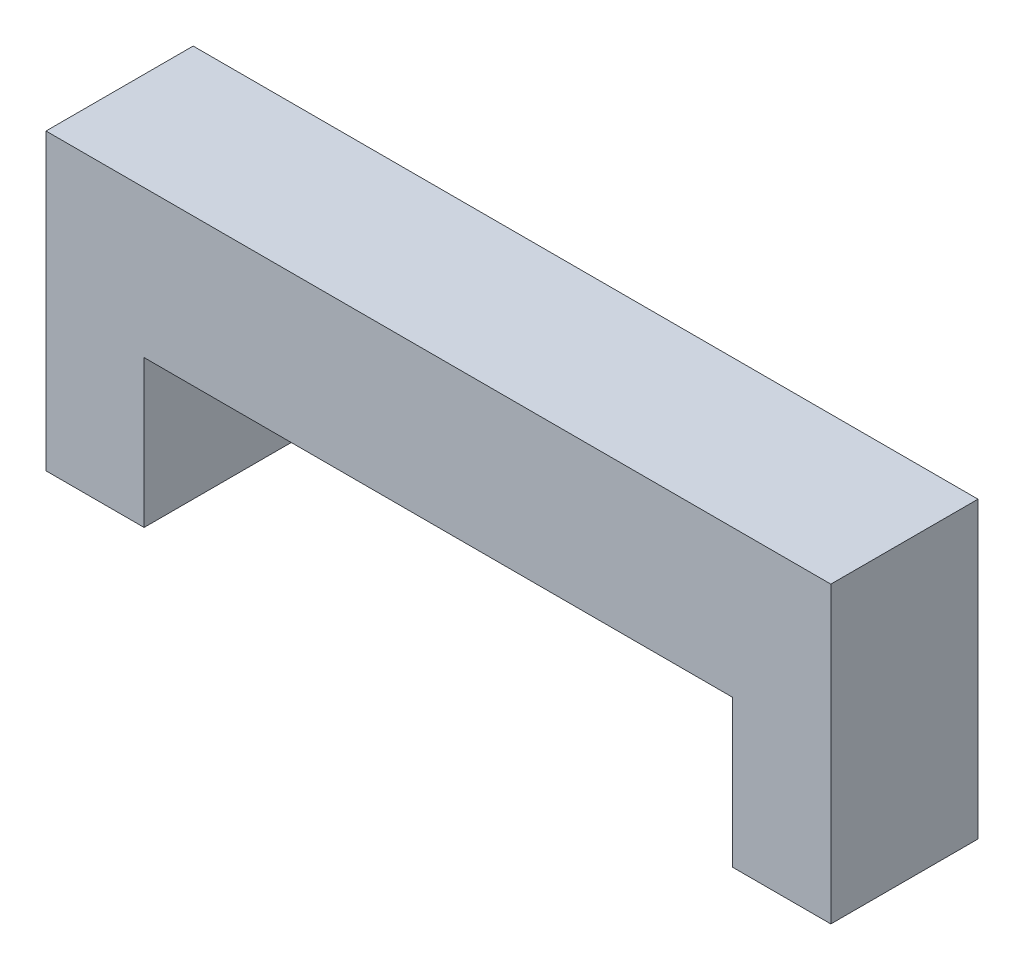
ISO-10303-21;
HEADER;
FILE_DESCRIPTION(('STEP AP214'),'2;1');
FILE_NAME('part.step','',(''),(''),'','','');
FILE_SCHEMA(('AUTOMOTIVE_DESIGN { 1 0 10303 214 1 1 1 1 }'));
ENDSEC;
DATA;
#1=APPLICATION_CONTEXT('core data for automotive mechanical design processes');
#2=APPLICATION_PROTOCOL_DEFINITION('international standard','automotive_design',2000,#1);
#3=PRODUCT_CONTEXT('',#1,'mechanical');
#4=PRODUCT('Part','Part','',(#3));
#5=PRODUCT_RELATED_PRODUCT_CATEGORY('part','',(#4));
#6=PRODUCT_DEFINITION_FORMATION('','',#4);
#7=PRODUCT_DEFINITION_CONTEXT('part definition',#1,'design');
#8=PRODUCT_DEFINITION('design','',#6,#7);
#9=PRODUCT_DEFINITION_SHAPE('','',#8);
#10=(LENGTH_UNIT() NAMED_UNIT(*) SI_UNIT(.MILLI.,.METRE.));
#11=(NAMED_UNIT(*) PLANE_ANGLE_UNIT() SI_UNIT($,.RADIAN.));
#12=(NAMED_UNIT(*) SI_UNIT($,.STERADIAN.) SOLID_ANGLE_UNIT());
#13=UNCERTAINTY_MEASURE_WITH_UNIT(LENGTH_MEASURE(1.E-05),#10,'distance_accuracy_value','');
#14=(GEOMETRIC_REPRESENTATION_CONTEXT(3) GLOBAL_UNCERTAINTY_ASSIGNED_CONTEXT((#13)) GLOBAL_UNIT_ASSIGNED_CONTEXT((#10,
#11,#12)) REPRESENTATION_CONTEXT('',''));
#15=CARTESIAN_POINT('',(0.,0.,0.));
#16=DIRECTION('',(0.,0.,1.));
#17=DIRECTION('',(1.,0.,0.));
#18=AXIS2_PLACEMENT_3D('',#15,#16,#17);
#19=CARTESIAN_POINT('',(-22.688524590164,9.08196721311476,3.));
#20=DIRECTION('',(1.,0.,0.));
#21=DIRECTION('',(0.,0.,-1.));
#22=AXIS2_PLACEMENT_3D('',#19,#20,#21);
#23=PLANE('',#22);
#24=DIRECTION('',(0.,-1.,0.));
#25=VECTOR('',#24,1.);
#26=CARTESIAN_POINT('',(-22.688524590164,9.08196721311476,0.));
#27=LINE('',#26,#25);
#28=CARTESIAN_POINT('',(-22.688524590164,9.08196721311476,0.));
#29=VERTEX_POINT('',#28);
#30=CARTESIAN_POINT('',(-22.688524590164,3.08196721311476,0.));
#31=VERTEX_POINT('',#30);
#32=EDGE_CURVE('E129',#29,#31,#27,.T.);
#33=ORIENTED_EDGE('',*,*,#32,.T.);
#34=DIRECTION('',(0.,0.,-1.));
#35=VECTOR('',#34,1.);
#36=CARTESIAN_POINT('',(-22.688524590164,3.08196721311476,3.));
#37=LINE('',#36,#35);
#38=CARTESIAN_POINT('',(-22.688524590164,3.08196721311476,3.));
#39=VERTEX_POINT('',#38);
#40=EDGE_CURVE('E11',#39,#31,#37,.T.);
#41=ORIENTED_EDGE('',*,*,#40,.F.);
#42=DIRECTION('',(0.,-1.,0.));
#43=VECTOR('',#42,1.);
#44=CARTESIAN_POINT('',(-22.688524590164,9.08196721311476,3.));
#45=LINE('',#44,#43);
#46=CARTESIAN_POINT('',(-22.688524590164,9.08196721311476,3.));
#47=VERTEX_POINT('',#46);
#48=EDGE_CURVE('E143',#47,#39,#45,.T.);
#49=ORIENTED_EDGE('',*,*,#48,.F.);
#50=DIRECTION('',(0.,0.,-1.));
#51=VECTOR('',#50,1.);
#52=CARTESIAN_POINT('',(-22.688524590164,9.08196721311476,3.));
#53=LINE('',#52,#51);
#54=EDGE_CURVE('E125',#47,#29,#53,.T.);
#55=ORIENTED_EDGE('',*,*,#54,.T.);
#56=EDGE_LOOP('',(#33,#41,#49,#55));
#57=FACE_BOUND('',#56,.T.);
#58=ADVANCED_FACE('F33',(#57),#23,.F.);
#59=CARTESIAN_POINT('',(-22.688524590164,3.08196721311476,3.));
#60=DIRECTION('',(0.,1.,0.));
#61=DIRECTION('',(0.,0.,1.));
#62=AXIS2_PLACEMENT_3D('',#59,#60,#61);
#63=PLANE('',#62);
#64=DIRECTION('',(1.,0.,0.));
#65=VECTOR('',#64,1.);
#66=CARTESIAN_POINT('',(-22.688524590164,3.08196721311476,0.));
#67=LINE('',#66,#65);
#68=CARTESIAN_POINT('',(-20.688524590164,3.08196721311476,0.));
#69=VERTEX_POINT('',#68);
#70=EDGE_CURVE('E132',#31,#69,#67,.T.);
#71=ORIENTED_EDGE('',*,*,#70,.T.);
#72=DIRECTION('',(0.,0.,-1.));
#73=VECTOR('',#72,1.);
#74=CARTESIAN_POINT('',(-20.688524590164,3.08196721311476,3.));
#75=LINE('',#74,#73);
#76=CARTESIAN_POINT('',(-20.688524590164,3.08196721311476,3.));
#77=VERTEX_POINT('',#76);
#78=EDGE_CURVE('E41',#77,#69,#75,.T.);
#79=ORIENTED_EDGE('',*,*,#78,.F.);
#80=DIRECTION('',(1.,0.,0.));
#81=VECTOR('',#80,1.);
#82=CARTESIAN_POINT('',(-22.688524590164,3.08196721311476,3.));
#83=LINE('',#82,#81);
#84=EDGE_CURVE('E92',#39,#77,#83,.T.);
#85=ORIENTED_EDGE('',*,*,#84,.F.);
#86=ORIENTED_EDGE('',*,*,#40,.T.);
#87=EDGE_LOOP('',(#71,#79,#85,#86));
#88=FACE_BOUND('',#87,.T.);
#89=ADVANCED_FACE('F178',(#88),#63,.F.);
#90=CARTESIAN_POINT('',(-20.688524590164,3.08196721311476,3.));
#91=DIRECTION('',(-1.,0.,0.));
#92=DIRECTION('',(0.,0.,1.));
#93=AXIS2_PLACEMENT_3D('',#90,#91,#92);
#94=PLANE('',#93);
#95=DIRECTION('',(0.,1.,0.));
#96=VECTOR('',#95,1.);
#97=CARTESIAN_POINT('',(-20.688524590164,3.08196721311476,0.));
#98=LINE('',#97,#96);
#99=CARTESIAN_POINT('',(-20.688524590164,6.08196721311476,0.));
#100=VERTEX_POINT('',#99);
#101=EDGE_CURVE('E134',#69,#100,#98,.T.);
#102=ORIENTED_EDGE('',*,*,#101,.T.);
#103=DIRECTION('',(0.,0.,-1.));
#104=VECTOR('',#103,1.);
#105=CARTESIAN_POINT('',(-20.688524590164,6.08196721311476,3.));
#106=LINE('',#105,#104);
#107=CARTESIAN_POINT('',(-20.688524590164,6.08196721311476,3.));
#108=VERTEX_POINT('',#107);
#109=EDGE_CURVE('E150',#108,#100,#106,.T.);
#110=ORIENTED_EDGE('',*,*,#109,.F.);
#111=DIRECTION('',(0.,1.,0.));
#112=VECTOR('',#111,1.);
#113=CARTESIAN_POINT('',(-20.688524590164,3.08196721311476,3.));
#114=LINE('',#113,#112);
#115=EDGE_CURVE('E158',#77,#108,#114,.T.);
#116=ORIENTED_EDGE('',*,*,#115,.F.);
#117=ORIENTED_EDGE('',*,*,#78,.T.);
#118=EDGE_LOOP('',(#102,#110,#116,#117));
#119=FACE_BOUND('',#118,.T.);
#120=ADVANCED_FACE('F156',(#119),#94,.F.);
#121=CARTESIAN_POINT('',(-20.688524590164,6.08196721311476,3.));
#122=DIRECTION('',(0.,1.,0.));
#123=DIRECTION('',(-1.,0.,0.));
#124=AXIS2_PLACEMENT_3D('',#121,#122,#123);
#125=PLANE('',#124);
#126=DIRECTION('',(1.,0.,0.));
#127=VECTOR('',#126,1.);
#128=CARTESIAN_POINT('',(-20.688524590164,6.08196721311476,0.));
#129=LINE('',#128,#127);
#130=CARTESIAN_POINT('',(-8.68852459016396,6.08196721311476,0.));
#131=VERTEX_POINT('',#130);
#132=EDGE_CURVE('E136',#100,#131,#129,.T.);
#133=ORIENTED_EDGE('',*,*,#132,.T.);
#134=DIRECTION('',(0.,0.,-1.));
#135=VECTOR('',#134,1.);
#136=CARTESIAN_POINT('',(-8.68852459016396,6.08196721311476,3.));
#137=LINE('',#136,#135);
#138=CARTESIAN_POINT('',(-8.68852459016396,6.08196721311476,3.));
#139=VERTEX_POINT('',#138);
#140=EDGE_CURVE('E147',#139,#131,#137,.T.);
#141=ORIENTED_EDGE('',*,*,#140,.F.);
#142=DIRECTION('',(1.,0.,0.));
#143=VECTOR('',#142,1.);
#144=CARTESIAN_POINT('',(-20.688524590164,6.08196721311476,3.));
#145=LINE('',#144,#143);
#146=EDGE_CURVE('E170',#108,#139,#145,.T.);
#147=ORIENTED_EDGE('',*,*,#146,.F.);
#148=ORIENTED_EDGE('',*,*,#109,.T.);
#149=EDGE_LOOP('',(#133,#141,#147,#148));
#150=FACE_BOUND('',#149,.T.);
#151=ADVANCED_FACE('F166',(#150),#125,.F.);
#152=CARTESIAN_POINT('',(-8.68852459016396,6.08196721311476,3.));
#153=DIRECTION('',(1.,0.,0.));
#154=DIRECTION('',(0.,0.,-1.));
#155=AXIS2_PLACEMENT_3D('',#152,#153,#154);
#156=PLANE('',#155);
#157=DIRECTION('',(0.,-1.,0.));
#158=VECTOR('',#157,1.);
#159=CARTESIAN_POINT('',(-8.68852459016396,6.08196721311476,0.));
#160=LINE('',#159,#158);
#161=CARTESIAN_POINT('',(-8.68852459016396,3.08196721311476,0.));
#162=VERTEX_POINT('',#161);
#163=EDGE_CURVE('E138',#131,#162,#160,.T.);
#164=ORIENTED_EDGE('',*,*,#163,.T.);
#165=DIRECTION('',(0.,0.,-1.));
#166=VECTOR('',#165,1.);
#167=CARTESIAN_POINT('',(-8.68852459016396,3.08196721311476,3.));
#168=LINE('',#167,#166);
#169=CARTESIAN_POINT('',(-8.68852459016396,3.08196721311476,3.));
#170=VERTEX_POINT('',#169);
#171=EDGE_CURVE('E120',#170,#162,#168,.T.);
#172=ORIENTED_EDGE('',*,*,#171,.F.);
#173=DIRECTION('',(0.,-1.,0.));
#174=VECTOR('',#173,1.);
#175=CARTESIAN_POINT('',(-8.68852459016396,6.08196721311476,3.));
#176=LINE('',#175,#174);
#177=EDGE_CURVE('E111',#139,#170,#176,.T.);
#178=ORIENTED_EDGE('',*,*,#177,.F.);
#179=ORIENTED_EDGE('',*,*,#140,.T.);
#180=EDGE_LOOP('',(#164,#172,#178,#179));
#181=FACE_BOUND('',#180,.T.);
#182=ADVANCED_FACE('F169',(#181),#156,.F.);
#183=CARTESIAN_POINT('',(-8.68852459016396,3.08196721311476,3.));
#184=DIRECTION('',(0.,1.,0.));
#185=DIRECTION('',(0.,0.,1.));
#186=AXIS2_PLACEMENT_3D('',#183,#184,#185);
#187=PLANE('',#186);
#188=DIRECTION('',(1.,0.,0.));
#189=VECTOR('',#188,1.);
#190=CARTESIAN_POINT('',(-8.68852459016396,3.08196721311476,0.));
#191=LINE('',#190,#189);
#192=CARTESIAN_POINT('',(-6.68852459016396,3.08196721311476,0.));
#193=VERTEX_POINT('',#192);
#194=EDGE_CURVE('E119',#162,#193,#191,.T.);
#195=ORIENTED_EDGE('',*,*,#194,.T.);
#196=DIRECTION('',(0.,0.,-1.));
#197=VECTOR('',#196,1.);
#198=CARTESIAN_POINT('',(-6.68852459016396,3.08196721311476,3.));
#199=LINE('',#198,#197);
#200=CARTESIAN_POINT('',(-6.68852459016396,3.08196721311476,3.));
#201=VERTEX_POINT('',#200);
#202=EDGE_CURVE('E116',#201,#193,#199,.T.);
#203=ORIENTED_EDGE('',*,*,#202,.F.);
#204=DIRECTION('',(1.,0.,0.));
#205=VECTOR('',#204,1.);
#206=CARTESIAN_POINT('',(-8.68852459016396,3.08196721311476,3.));
#207=LINE('',#206,#205);
#208=EDGE_CURVE('E105',#170,#201,#207,.T.);
#209=ORIENTED_EDGE('',*,*,#208,.F.);
#210=ORIENTED_EDGE('',*,*,#171,.T.);
#211=EDGE_LOOP('',(#195,#203,#209,#210));
#212=FACE_BOUND('',#211,.T.);
#213=ADVANCED_FACE('F117',(#212),#187,.F.);
#214=CARTESIAN_POINT('',(-6.68852459016396,3.08196721311476,3.));
#215=DIRECTION('',(-1.,0.,0.));
#216=DIRECTION('',(0.,0.,1.));
#217=AXIS2_PLACEMENT_3D('',#214,#215,#216);
#218=PLANE('',#217);
#219=DIRECTION('',(0.,1.,0.));
#220=VECTOR('',#219,1.);
#221=CARTESIAN_POINT('',(-6.68852459016396,3.08196721311476,0.));
#222=LINE('',#221,#220);
#223=CARTESIAN_POINT('',(-6.68852459016396,9.08196721311476,0.));
#224=VERTEX_POINT('',#223);
#225=EDGE_CURVE('E78',#193,#224,#222,.T.);
#226=ORIENTED_EDGE('',*,*,#225,.T.);
#227=DIRECTION('',(0.,0.,-1.));
#228=VECTOR('',#227,1.);
#229=CARTESIAN_POINT('',(-6.68852459016396,9.08196721311476,3.));
#230=LINE('',#229,#228);
#231=CARTESIAN_POINT('',(-6.68852459016396,9.08196721311476,3.));
#232=VERTEX_POINT('',#231);
#233=EDGE_CURVE('E121',#232,#224,#230,.T.);
#234=ORIENTED_EDGE('',*,*,#233,.F.);
#235=DIRECTION('',(0.,1.,0.));
#236=VECTOR('',#235,1.);
#237=CARTESIAN_POINT('',(-6.68852459016396,3.08196721311476,3.));
#238=LINE('',#237,#236);
#239=EDGE_CURVE('E109',#201,#232,#238,.T.);
#240=ORIENTED_EDGE('',*,*,#239,.F.);
#241=ORIENTED_EDGE('',*,*,#202,.T.);
#242=EDGE_LOOP('',(#226,#234,#240,#241));
#243=FACE_BOUND('',#242,.T.);
#244=ADVANCED_FACE('F123',(#243),#218,.F.);
#245=CARTESIAN_POINT('',(-6.68852459016396,9.08196721311476,3.));
#246=DIRECTION('',(0.,-1.,0.));
#247=DIRECTION('',(1.,0.,0.));
#248=AXIS2_PLACEMENT_3D('',#245,#246,#247);
#249=PLANE('',#248);
#250=DIRECTION('',(-1.,0.,0.));
#251=VECTOR('',#250,1.);
#252=CARTESIAN_POINT('',(-6.68852459016396,9.08196721311476,0.));
#253=LINE('',#252,#251);
#254=EDGE_CURVE('E84',#224,#29,#253,.T.);
#255=ORIENTED_EDGE('',*,*,#254,.T.);
#256=ORIENTED_EDGE('',*,*,#54,.F.);
#257=DIRECTION('',(-1.,0.,0.));
#258=VECTOR('',#257,1.);
#259=CARTESIAN_POINT('',(-6.68852459016396,9.08196721311476,3.));
#260=LINE('',#259,#258);
#261=EDGE_CURVE('E49',#232,#47,#260,.T.);
#262=ORIENTED_EDGE('',*,*,#261,.F.);
#263=ORIENTED_EDGE('',*,*,#233,.T.);
#264=EDGE_LOOP('',(#255,#256,#262,#263));
#265=FACE_BOUND('',#264,.T.);
#266=ADVANCED_FACE('F194',(#265),#249,.F.);
#267=CARTESIAN_POINT('',(0.,0.,3.));
#268=DIRECTION('',(0.,0.,1.));
#269=DIRECTION('',(1.,0.,0.));
#270=AXIS2_PLACEMENT_3D('',#267,#268,#269);
#271=PLANE('',#270);
#272=ORIENTED_EDGE('',*,*,#48,.T.);
#273=ORIENTED_EDGE('',*,*,#84,.T.);
#274=ORIENTED_EDGE('',*,*,#115,.T.);
#275=ORIENTED_EDGE('',*,*,#146,.T.);
#276=ORIENTED_EDGE('',*,*,#177,.T.);
#277=ORIENTED_EDGE('',*,*,#208,.T.);
#278=ORIENTED_EDGE('',*,*,#239,.T.);
#279=ORIENTED_EDGE('',*,*,#261,.T.);
#280=EDGE_LOOP('',(#272,#273,#274,#275,#276,#277,#278,#279));
#281=FACE_BOUND('',#280,.T.);
#282=ADVANCED_FACE('F107',(#281),#271,.T.);
#283=CARTESIAN_POINT('',(0.,0.,0.));
#284=DIRECTION('',(0.,0.,1.));
#285=DIRECTION('',(1.,0.,0.));
#286=AXIS2_PLACEMENT_3D('',#283,#284,#285);
#287=PLANE('',#286);
#288=ORIENTED_EDGE('',*,*,#32,.F.);
#289=ORIENTED_EDGE('',*,*,#254,.F.);
#290=ORIENTED_EDGE('',*,*,#225,.F.);
#291=ORIENTED_EDGE('',*,*,#194,.F.);
#292=ORIENTED_EDGE('',*,*,#163,.F.);
#293=ORIENTED_EDGE('',*,*,#132,.F.);
#294=ORIENTED_EDGE('',*,*,#101,.F.);
#295=ORIENTED_EDGE('',*,*,#70,.F.);
#296=EDGE_LOOP('',(#288,#289,#290,#291,#292,#293,#294,#295));
#297=FACE_BOUND('',#296,.T.);
#298=ADVANCED_FACE('F162',(#297),#287,.F.);
#299=CLOSED_SHELL('',(#58,#89,#120,#151,#182,#213,#244,#266,#282,#298));
#300=MANIFOLD_SOLID_BREP('B2',#299);
#301=ADVANCED_BREP_SHAPE_REPRESENTATION('',(#18,#300),#14);
#302=SHAPE_DEFINITION_REPRESENTATION(#9,#301);
ENDSEC;
END-ISO-10303-21;
